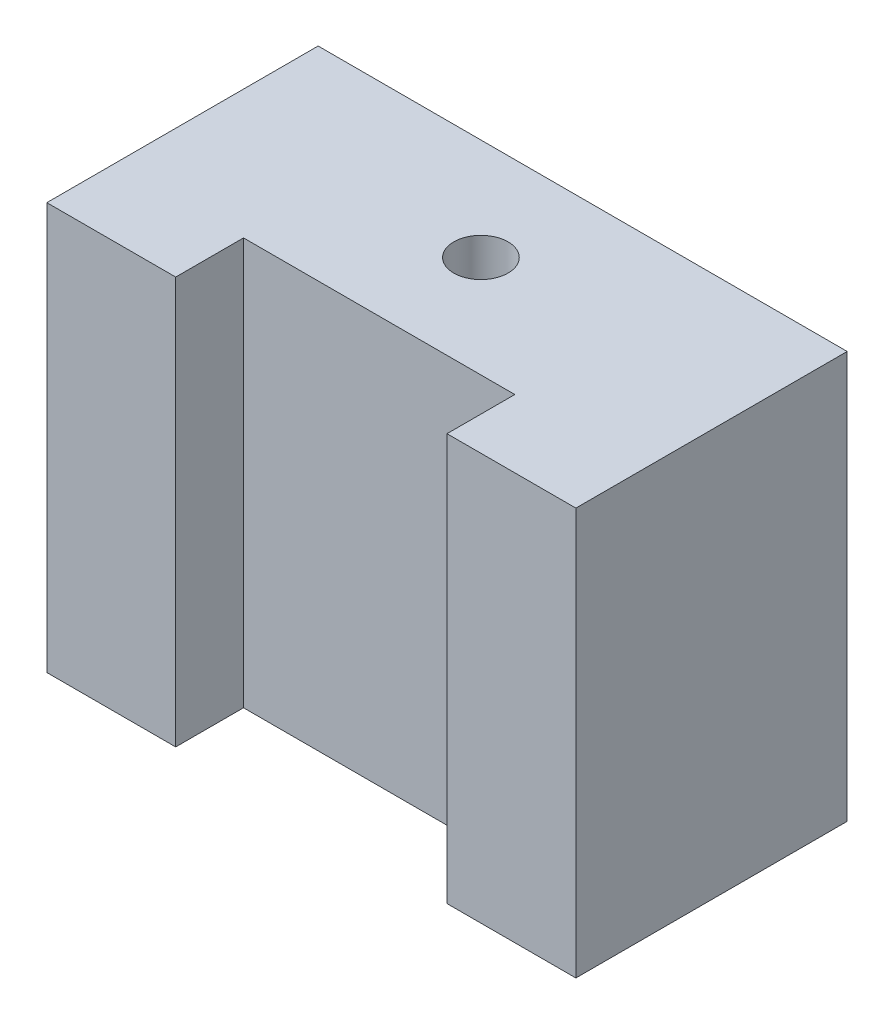
ISO-10303-21;
HEADER;
FILE_DESCRIPTION(('STEP AP214'),'2;1');
FILE_NAME('part.step','',(''),(''),'','','');
FILE_SCHEMA(('AUTOMOTIVE_DESIGN { 1 0 10303 214 1 1 1 1 }'));
ENDSEC;
DATA;
#1=APPLICATION_CONTEXT('core data for automotive mechanical design processes');
#2=APPLICATION_PROTOCOL_DEFINITION('international standard','automotive_design',2000,#1);
#3=PRODUCT_CONTEXT('',#1,'mechanical');
#4=PRODUCT('Part','Part','',(#3));
#5=PRODUCT_RELATED_PRODUCT_CATEGORY('part','',(#4));
#6=PRODUCT_DEFINITION_FORMATION('','',#4);
#7=PRODUCT_DEFINITION_CONTEXT('part definition',#1,'design');
#8=PRODUCT_DEFINITION('design','',#6,#7);
#9=PRODUCT_DEFINITION_SHAPE('','',#8);
#10=(LENGTH_UNIT() NAMED_UNIT(*) SI_UNIT(.MILLI.,.METRE.));
#11=(NAMED_UNIT(*) PLANE_ANGLE_UNIT() SI_UNIT($,.RADIAN.));
#12=(NAMED_UNIT(*) SI_UNIT($,.STERADIAN.) SOLID_ANGLE_UNIT());
#13=UNCERTAINTY_MEASURE_WITH_UNIT(LENGTH_MEASURE(1.E-05),#10,'distance_accuracy_value','');
#14=(GEOMETRIC_REPRESENTATION_CONTEXT(3) GLOBAL_UNCERTAINTY_ASSIGNED_CONTEXT((#13)) GLOBAL_UNIT_ASSIGNED_CONTEXT((#10,
#11,#12)) REPRESENTATION_CONTEXT('',''));
#15=CARTESIAN_POINT('',(0.,0.,0.));
#16=DIRECTION('',(0.,0.,1.));
#17=DIRECTION('',(1.,0.,0.));
#18=AXIS2_PLACEMENT_3D('',#15,#16,#17);
#19=CARTESIAN_POINT('',(0.,0.,30.));
#20=DIRECTION('',(0.,0.,-1.));
#21=DIRECTION('',(-1.,0.,0.));
#22=AXIS2_PLACEMENT_3D('',#19,#20,#21);
#23=PLANE('',#22);
#24=DIRECTION('',(0.,1.,0.));
#25=VECTOR('',#24,1.);
#26=CARTESIAN_POINT('',(-20.,0.,30.));
#27=LINE('',#26,#25);
#28=CARTESIAN_POINT('',(-20.,-30.,30.));
#29=VERTEX_POINT('',#28);
#30=CARTESIAN_POINT('',(-20.,30.,30.));
#31=VERTEX_POINT('',#30);
#32=EDGE_CURVE('E57',#29,#31,#27,.T.);
#33=ORIENTED_EDGE('',*,*,#32,.F.);
#34=DIRECTION('',(1.,0.,0.));
#35=VECTOR('',#34,1.);
#36=CARTESIAN_POINT('',(-39.,-30.,30.));
#37=LINE('',#36,#35);
#38=CARTESIAN_POINT('',(20.,-30.,30.));
#39=VERTEX_POINT('',#38);
#40=EDGE_CURVE('E125',#29,#39,#37,.T.);
#41=ORIENTED_EDGE('',*,*,#40,.T.);
#42=DIRECTION('',(0.,1.,0.));
#43=VECTOR('',#42,1.);
#44=CARTESIAN_POINT('',(20.,0.,30.));
#45=LINE('',#44,#43);
#46=CARTESIAN_POINT('',(20.,30.,30.));
#47=VERTEX_POINT('',#46);
#48=EDGE_CURVE('E126',#39,#47,#45,.T.);
#49=ORIENTED_EDGE('',*,*,#48,.T.);
#50=DIRECTION('',(-1.,0.,0.));
#51=VECTOR('',#50,1.);
#52=CARTESIAN_POINT('',(-39.,30.,30.));
#53=LINE('',#52,#51);
#54=EDGE_CURVE('E53',#47,#31,#53,.T.);
#55=ORIENTED_EDGE('',*,*,#54,.T.);
#56=EDGE_LOOP('',(#33,#41,#49,#55));
#57=FACE_BOUND('',#56,.T.);
#58=ADVANCED_FACE('F38',(#57),#23,.F.);
#59=CARTESIAN_POINT('',(39.,-30.,30.));
#60=DIRECTION('',(-1.,0.,0.));
#61=DIRECTION('',(0.,0.,1.));
#62=AXIS2_PLACEMENT_3D('',#59,#60,#61);
#63=PLANE('',#62);
#64=DIRECTION('',(0.,1.,0.));
#65=VECTOR('',#64,1.);
#66=CARTESIAN_POINT('',(39.,-30.,0.));
#67=LINE('',#66,#65);
#68=CARTESIAN_POINT('',(39.,-30.,0.));
#69=VERTEX_POINT('',#68);
#70=CARTESIAN_POINT('',(39.,30.,0.));
#71=VERTEX_POINT('',#70);
#72=EDGE_CURVE('E147',#69,#71,#67,.T.);
#73=ORIENTED_EDGE('',*,*,#72,.T.);
#74=DIRECTION('',(0.,0.,-1.));
#75=VECTOR('',#74,1.);
#76=CARTESIAN_POINT('',(39.,30.,30.));
#77=LINE('',#76,#75);
#78=CARTESIAN_POINT('',(39.,30.,40.));
#79=VERTEX_POINT('',#78);
#80=EDGE_CURVE('E11',#79,#71,#77,.T.);
#81=ORIENTED_EDGE('',*,*,#80,.F.);
#82=DIRECTION('',(0.,1.,0.));
#83=VECTOR('',#82,1.);
#84=CARTESIAN_POINT('',(39.,0.,40.));
#85=LINE('',#84,#83);
#86=CARTESIAN_POINT('',(39.,-30.,40.));
#87=VERTEX_POINT('',#86);
#88=EDGE_CURVE('E138',#87,#79,#85,.T.);
#89=ORIENTED_EDGE('',*,*,#88,.F.);
#90=DIRECTION('',(0.,0.,-1.));
#91=VECTOR('',#90,1.);
#92=CARTESIAN_POINT('',(39.,-30.,30.));
#93=LINE('',#92,#91);
#94=EDGE_CURVE('E151',#87,#69,#93,.T.);
#95=ORIENTED_EDGE('',*,*,#94,.T.);
#96=EDGE_LOOP('',(#73,#81,#89,#95));
#97=FACE_BOUND('',#96,.T.);
#98=ADVANCED_FACE('F40',(#97),#63,.F.);
#99=CARTESIAN_POINT('',(-39.,30.,30.));
#100=DIRECTION('',(0.,-1.,0.));
#101=DIRECTION('',(0.,0.,-1.));
#102=AXIS2_PLACEMENT_3D('',#99,#100,#101);
#103=PLANE('',#102);
#104=CARTESIAN_POINT('',(0.,30.,15.));
#105=DIRECTION('',(0.,1.,0.));
#106=DIRECTION('',(0.,0.,1.));
#107=AXIS2_PLACEMENT_3D('',#104,#105,#106);
#108=CIRCLE('',#107,4.);
#109=CARTESIAN_POINT('',(0.,30.,19.));
#110=VERTEX_POINT('',#109);
#111=EDGE_CURVE('E203',#110,#110,#108,.T.);
#112=ORIENTED_EDGE('',*,*,#111,.F.);
#113=EDGE_LOOP('',(#112));
#114=FACE_BOUND('',#113,.T.);
#115=DIRECTION('',(-1.,0.,0.));
#116=VECTOR('',#115,1.);
#117=CARTESIAN_POINT('',(-39.,30.,0.));
#118=LINE('',#117,#116);
#119=CARTESIAN_POINT('',(-39.,30.,0.));
#120=VERTEX_POINT('',#119);
#121=EDGE_CURVE('E154',#71,#120,#118,.T.);
#122=ORIENTED_EDGE('',*,*,#121,.T.);
#123=DIRECTION('',(0.,0.,-1.));
#124=VECTOR('',#123,1.);
#125=CARTESIAN_POINT('',(-39.,30.,30.));
#126=LINE('',#125,#124);
#127=CARTESIAN_POINT('',(-39.,30.,40.));
#128=VERTEX_POINT('',#127);
#129=EDGE_CURVE('E46',#128,#120,#126,.T.);
#130=ORIENTED_EDGE('',*,*,#129,.F.);
#131=DIRECTION('',(-1.,0.,0.));
#132=VECTOR('',#131,1.);
#133=CARTESIAN_POINT('',(0.,30.,40.));
#134=LINE('',#133,#132);
#135=CARTESIAN_POINT('',(-20.,30.,40.));
#136=VERTEX_POINT('',#135);
#137=EDGE_CURVE('E112',#136,#128,#134,.T.);
#138=ORIENTED_EDGE('',*,*,#137,.F.);
#139=DIRECTION('',(0.,0.,-1.));
#140=VECTOR('',#139,1.);
#141=CARTESIAN_POINT('',(-20.,30.,40.));
#142=LINE('',#141,#140);
#143=EDGE_CURVE('E108',#136,#31,#142,.T.);
#144=ORIENTED_EDGE('',*,*,#143,.T.);
#145=ORIENTED_EDGE('',*,*,#54,.F.);
#146=DIRECTION('',(0.,0.,-1.));
#147=VECTOR('',#146,1.);
#148=CARTESIAN_POINT('',(20.,30.,40.));
#149=LINE('',#148,#147);
#150=CARTESIAN_POINT('',(20.,30.,40.));
#151=VERTEX_POINT('',#150);
#152=EDGE_CURVE('E142',#151,#47,#149,.T.);
#153=ORIENTED_EDGE('',*,*,#152,.F.);
#154=DIRECTION('',(-1.,0.,0.));
#155=VECTOR('',#154,1.);
#156=CARTESIAN_POINT('',(0.,30.,40.));
#157=LINE('',#156,#155);
#158=EDGE_CURVE('E141',#79,#151,#157,.T.);
#159=ORIENTED_EDGE('',*,*,#158,.F.);
#160=ORIENTED_EDGE('',*,*,#80,.T.);
#161=EDGE_LOOP('',(#122,#130,#138,#144,#145,#153,#159,#160));
#162=FACE_BOUND('',#161,.T.);
#163=ADVANCED_FACE('F179',(#114,#162),#103,.F.);
#164=CARTESIAN_POINT('',(-39.,-30.,30.));
#165=DIRECTION('',(1.,0.,0.));
#166=DIRECTION('',(0.,0.,-1.));
#167=AXIS2_PLACEMENT_3D('',#164,#165,#166);
#168=PLANE('',#167);
#169=DIRECTION('',(0.,-1.,0.));
#170=VECTOR('',#169,1.);
#171=CARTESIAN_POINT('',(-39.,-30.,0.));
#172=LINE('',#171,#170);
#173=CARTESIAN_POINT('',(-39.,-30.,0.));
#174=VERTEX_POINT('',#173);
#175=EDGE_CURVE('E156',#120,#174,#172,.T.);
#176=ORIENTED_EDGE('',*,*,#175,.T.);
#177=DIRECTION('',(0.,0.,-1.));
#178=VECTOR('',#177,1.);
#179=CARTESIAN_POINT('',(-39.,-30.,30.));
#180=LINE('',#179,#178);
#181=CARTESIAN_POINT('',(-39.,-30.,40.));
#182=VERTEX_POINT('',#181);
#183=EDGE_CURVE('E161',#182,#174,#180,.T.);
#184=ORIENTED_EDGE('',*,*,#183,.F.);
#185=DIRECTION('',(0.,-1.,0.));
#186=VECTOR('',#185,1.);
#187=CARTESIAN_POINT('',(-39.,0.,40.));
#188=LINE('',#187,#186);
#189=EDGE_CURVE('E119',#128,#182,#188,.T.);
#190=ORIENTED_EDGE('',*,*,#189,.F.);
#191=ORIENTED_EDGE('',*,*,#129,.T.);
#192=EDGE_LOOP('',(#176,#184,#190,#191));
#193=FACE_BOUND('',#192,.T.);
#194=ADVANCED_FACE('F165',(#193),#168,.F.);
#195=CARTESIAN_POINT('',(-39.,-30.,30.));
#196=DIRECTION('',(0.,1.,0.));
#197=DIRECTION('',(0.,0.,1.));
#198=AXIS2_PLACEMENT_3D('',#195,#196,#197);
#199=PLANE('',#198);
#200=CARTESIAN_POINT('',(0.,-30.,15.));
#201=DIRECTION('',(0.,1.,0.));
#202=DIRECTION('',(0.,0.,1.));
#203=AXIS2_PLACEMENT_3D('',#200,#201,#202);
#204=CIRCLE('',#203,4.);
#205=CARTESIAN_POINT('',(0.,-30.,19.));
#206=VERTEX_POINT('',#205);
#207=EDGE_CURVE('E205',#206,#206,#204,.T.);
#208=ORIENTED_EDGE('',*,*,#207,.T.);
#209=EDGE_LOOP('',(#208));
#210=FACE_BOUND('',#209,.T.);
#211=DIRECTION('',(1.,0.,0.));
#212=VECTOR('',#211,1.);
#213=CARTESIAN_POINT('',(-39.,-30.,0.));
#214=LINE('',#213,#212);
#215=EDGE_CURVE('E149',#174,#69,#214,.T.);
#216=ORIENTED_EDGE('',*,*,#215,.T.);
#217=ORIENTED_EDGE('',*,*,#94,.F.);
#218=DIRECTION('',(1.,0.,0.));
#219=VECTOR('',#218,1.);
#220=CARTESIAN_POINT('',(0.,-30.,40.));
#221=LINE('',#220,#219);
#222=CARTESIAN_POINT('',(20.,-30.,40.));
#223=VERTEX_POINT('',#222);
#224=EDGE_CURVE('E135',#223,#87,#221,.T.);
#225=ORIENTED_EDGE('',*,*,#224,.F.);
#226=DIRECTION('',(0.,0.,-1.));
#227=VECTOR('',#226,1.);
#228=CARTESIAN_POINT('',(20.,-30.,40.));
#229=LINE('',#228,#227);
#230=EDGE_CURVE('E145',#223,#39,#229,.T.);
#231=ORIENTED_EDGE('',*,*,#230,.T.);
#232=ORIENTED_EDGE('',*,*,#40,.F.);
#233=DIRECTION('',(0.,0.,-1.));
#234=VECTOR('',#233,1.);
#235=CARTESIAN_POINT('',(-20.,-30.,40.));
#236=LINE('',#235,#234);
#237=CARTESIAN_POINT('',(-20.,-30.,40.));
#238=VERTEX_POINT('',#237);
#239=EDGE_CURVE('E106',#238,#29,#236,.T.);
#240=ORIENTED_EDGE('',*,*,#239,.F.);
#241=DIRECTION('',(1.,0.,0.));
#242=VECTOR('',#241,1.);
#243=CARTESIAN_POINT('',(0.,-30.,40.));
#244=LINE('',#243,#242);
#245=EDGE_CURVE('E113',#182,#238,#244,.T.);
#246=ORIENTED_EDGE('',*,*,#245,.F.);
#247=ORIENTED_EDGE('',*,*,#183,.T.);
#248=EDGE_LOOP('',(#216,#217,#225,#231,#232,#240,#246,#247));
#249=FACE_BOUND('',#248,.T.);
#250=ADVANCED_FACE('F123',(#210,#249),#199,.F.);
#251=CARTESIAN_POINT('',(0.,0.,0.));
#252=DIRECTION('',(0.,0.,-1.));
#253=DIRECTION('',(-1.,0.,0.));
#254=AXIS2_PLACEMENT_3D('',#251,#252,#253);
#255=PLANE('',#254);
#256=ORIENTED_EDGE('',*,*,#72,.F.);
#257=ORIENTED_EDGE('',*,*,#215,.F.);
#258=ORIENTED_EDGE('',*,*,#175,.F.);
#259=ORIENTED_EDGE('',*,*,#121,.F.);
#260=EDGE_LOOP('',(#256,#257,#258,#259));
#261=FACE_BOUND('',#260,.T.);
#262=ADVANCED_FACE('F170',(#261),#255,.T.);
#263=CARTESIAN_POINT('',(20.,0.,40.));
#264=DIRECTION('',(-1.,0.,0.));
#265=DIRECTION('',(0.,0.,1.));
#266=AXIS2_PLACEMENT_3D('',#263,#264,#265);
#267=PLANE('',#266);
#268=ORIENTED_EDGE('',*,*,#48,.F.);
#269=ORIENTED_EDGE('',*,*,#230,.F.);
#270=DIRECTION('',(0.,1.,0.));
#271=VECTOR('',#270,1.);
#272=CARTESIAN_POINT('',(20.,0.,40.));
#273=LINE('',#272,#271);
#274=EDGE_CURVE('E128',#223,#151,#273,.T.);
#275=ORIENTED_EDGE('',*,*,#274,.T.);
#276=ORIENTED_EDGE('',*,*,#152,.T.);
#277=EDGE_LOOP('',(#268,#269,#275,#276));
#278=FACE_BOUND('',#277,.T.);
#279=ADVANCED_FACE('F182',(#278),#267,.T.);
#280=CARTESIAN_POINT('',(0.,0.,40.));
#281=DIRECTION('',(0.,0.,1.));
#282=DIRECTION('',(1.,0.,0.));
#283=AXIS2_PLACEMENT_3D('',#280,#281,#282);
#284=PLANE('',#283);
#285=ORIENTED_EDGE('',*,*,#274,.F.);
#286=ORIENTED_EDGE('',*,*,#224,.T.);
#287=ORIENTED_EDGE('',*,*,#88,.T.);
#288=ORIENTED_EDGE('',*,*,#158,.T.);
#289=EDGE_LOOP('',(#285,#286,#287,#288));
#290=FACE_BOUND('',#289,.T.);
#291=ADVANCED_FACE('F177',(#290),#284,.T.);
#292=CARTESIAN_POINT('',(-20.,0.,40.));
#293=DIRECTION('',(-1.,0.,0.));
#294=DIRECTION('',(0.,0.,1.));
#295=AXIS2_PLACEMENT_3D('',#292,#293,#294);
#296=PLANE('',#295);
#297=ORIENTED_EDGE('',*,*,#32,.T.);
#298=ORIENTED_EDGE('',*,*,#143,.F.);
#299=DIRECTION('',(0.,1.,0.));
#300=VECTOR('',#299,1.);
#301=CARTESIAN_POINT('',(-20.,0.,40.));
#302=LINE('',#301,#300);
#303=EDGE_CURVE('E102',#238,#136,#302,.T.);
#304=ORIENTED_EDGE('',*,*,#303,.F.);
#305=ORIENTED_EDGE('',*,*,#239,.T.);
#306=EDGE_LOOP('',(#297,#298,#304,#305));
#307=FACE_BOUND('',#306,.T.);
#308=ADVANCED_FACE('F104',(#307),#296,.F.);
#309=CARTESIAN_POINT('',(0.,0.,40.));
#310=DIRECTION('',(0.,0.,1.));
#311=DIRECTION('',(1.,0.,0.));
#312=AXIS2_PLACEMENT_3D('',#309,#310,#311);
#313=PLANE('',#312);
#314=ORIENTED_EDGE('',*,*,#245,.T.);
#315=ORIENTED_EDGE('',*,*,#303,.T.);
#316=ORIENTED_EDGE('',*,*,#137,.T.);
#317=ORIENTED_EDGE('',*,*,#189,.T.);
#318=EDGE_LOOP('',(#314,#315,#316,#317));
#319=FACE_BOUND('',#318,.T.);
#320=ADVANCED_FACE('F117',(#319),#313,.T.);
#321=CARTESIAN_POINT('',(0.,-30.,15.));
#322=DIRECTION('',(0.,1.,0.));
#323=DIRECTION('',(0.,0.,1.));
#324=AXIS2_PLACEMENT_3D('',#321,#322,#323);
#325=CYLINDRICAL_SURFACE('',#324,4.);
#326=ORIENTED_EDGE('',*,*,#207,.F.);
#327=EDGE_LOOP('',(#326));
#328=FACE_BOUND('',#327,.T.);
#329=ORIENTED_EDGE('',*,*,#111,.T.);
#330=EDGE_LOOP('',(#329));
#331=FACE_BOUND('',#330,.T.);
#332=ADVANCED_FACE('F213',(#328,#331),#325,.F.);
#333=CLOSED_SHELL('',(#58,#98,#163,#194,#250,#262,#279,#291,#308,#320,#332));
#334=MANIFOLD_SOLID_BREP('B2',#333);
#335=ADVANCED_BREP_SHAPE_REPRESENTATION('',(#18,#334),#14);
#336=SHAPE_DEFINITION_REPRESENTATION(#9,#335);
ENDSEC;
END-ISO-10303-21;
